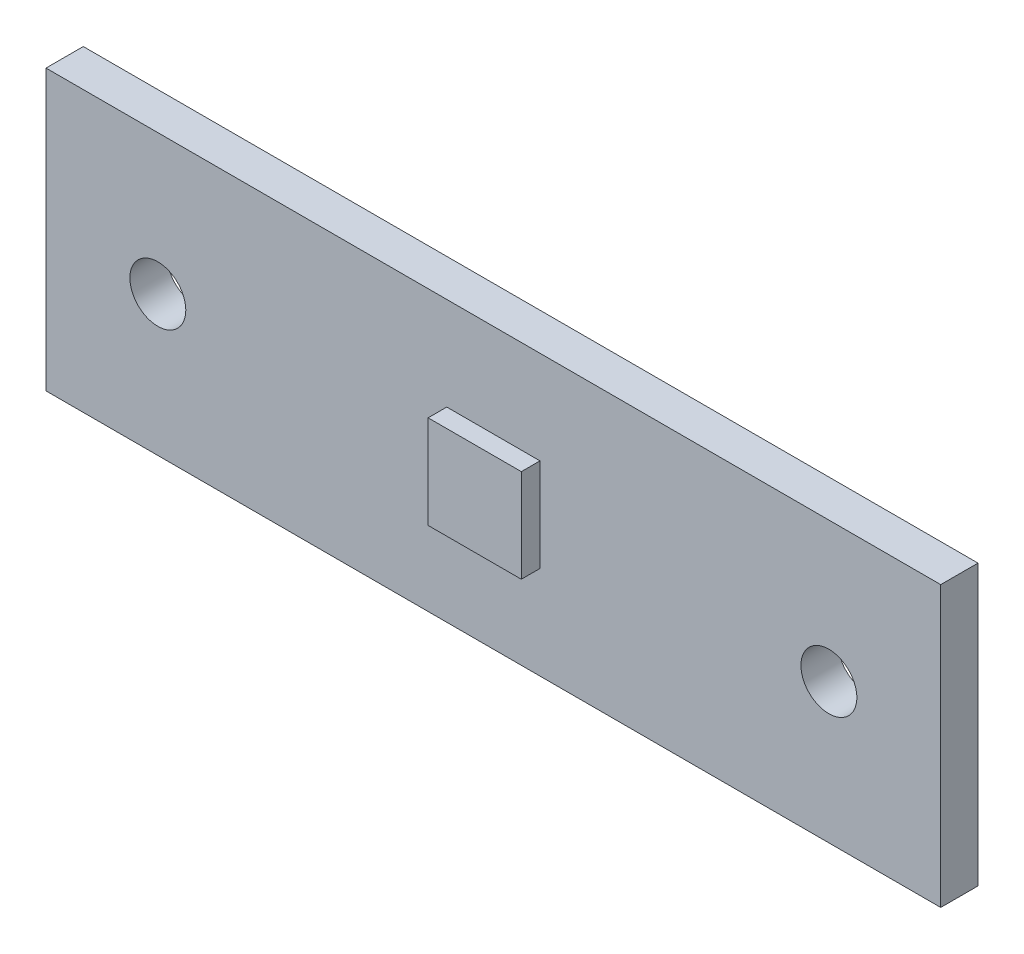
ISO-10303-21;
HEADER;
FILE_DESCRIPTION(('STEP AP214'),'2;1');
FILE_NAME('part.step','',(''),(''),'','','');
FILE_SCHEMA(('AUTOMOTIVE_DESIGN { 1 0 10303 214 1 1 1 1 }'));
ENDSEC;
DATA;
#1=APPLICATION_CONTEXT('core data for automotive mechanical design processes');
#2=APPLICATION_PROTOCOL_DEFINITION('international standard','automotive_design',2000,#1);
#3=PRODUCT_CONTEXT('',#1,'mechanical');
#4=PRODUCT('Part','Part','',(#3));
#5=PRODUCT_RELATED_PRODUCT_CATEGORY('part','',(#4));
#6=PRODUCT_DEFINITION_FORMATION('','',#4);
#7=PRODUCT_DEFINITION_CONTEXT('part definition',#1,'design');
#8=PRODUCT_DEFINITION('design','',#6,#7);
#9=PRODUCT_DEFINITION_SHAPE('','',#8);
#10=(LENGTH_UNIT() NAMED_UNIT(*) SI_UNIT(.MILLI.,.METRE.));
#11=(NAMED_UNIT(*) PLANE_ANGLE_UNIT() SI_UNIT($,.RADIAN.));
#12=(NAMED_UNIT(*) SI_UNIT($,.STERADIAN.) SOLID_ANGLE_UNIT());
#13=UNCERTAINTY_MEASURE_WITH_UNIT(LENGTH_MEASURE(1.E-05),#10,'distance_accuracy_value','');
#14=(GEOMETRIC_REPRESENTATION_CONTEXT(3) GLOBAL_UNCERTAINTY_ASSIGNED_CONTEXT((#13)) GLOBAL_UNIT_ASSIGNED_CONTEXT((#10,
#11,#12)) REPRESENTATION_CONTEXT('',''));
#15=CARTESIAN_POINT('',(0.,0.,0.));
#16=DIRECTION('',(0.,0.,1.));
#17=DIRECTION('',(1.,0.,0.));
#18=AXIS2_PLACEMENT_3D('',#15,#16,#17);
#19=CARTESIAN_POINT('',(0.,0.,2.));
#20=DIRECTION('',(0.,0.,-1.));
#21=DIRECTION('',(-1.,0.,0.));
#22=AXIS2_PLACEMENT_3D('',#19,#20,#21);
#23=PLANE('',#22);
#24=CARTESIAN_POINT('',(42.,7.5,2.));
#25=DIRECTION('',(0.,0.,1.));
#26=DIRECTION('',(-1.,0.,0.));
#27=AXIS2_PLACEMENT_3D('',#24,#25,#26);
#28=CIRCLE('',#27,1.5);
#29=CARTESIAN_POINT('',(40.5,7.5,2.));
#30=VERTEX_POINT('',#29);
#31=EDGE_CURVE('E122',#30,#30,#28,.T.);
#32=ORIENTED_EDGE('',*,*,#31,.F.);
#33=EDGE_LOOP('',(#32));
#34=FACE_BOUND('',#33,.T.);
#35=CARTESIAN_POINT('',(6.,7.5,2.));
#36=DIRECTION('',(0.,0.,1.));
#37=DIRECTION('',(1.,0.,0.));
#38=AXIS2_PLACEMENT_3D('',#35,#36,#37);
#39=CIRCLE('',#38,1.5);
#40=CARTESIAN_POINT('',(7.5,7.5,2.));
#41=VERTEX_POINT('',#40);
#42=EDGE_CURVE('E131',#41,#41,#39,.T.);
#43=ORIENTED_EDGE('',*,*,#42,.F.);
#44=EDGE_LOOP('',(#43));
#45=FACE_BOUND('',#44,.T.);
#46=DIRECTION('',(0.,-1.,0.));
#47=VECTOR('',#46,1.);
#48=CARTESIAN_POINT('',(0.,0.,2.));
#49=LINE('',#48,#47);
#50=CARTESIAN_POINT('',(0.,15.,2.));
#51=VERTEX_POINT('',#50);
#52=CARTESIAN_POINT('',(0.,0.,2.));
#53=VERTEX_POINT('',#52);
#54=EDGE_CURVE('E137',#51,#53,#49,.T.);
#55=ORIENTED_EDGE('',*,*,#54,.T.);
#56=DIRECTION('',(1.,0.,0.));
#57=VECTOR('',#56,1.);
#58=CARTESIAN_POINT('',(0.,0.,2.));
#59=LINE('',#58,#57);
#60=CARTESIAN_POINT('',(48.,0.,2.));
#61=VERTEX_POINT('',#60);
#62=EDGE_CURVE('E140',#53,#61,#59,.T.);
#63=ORIENTED_EDGE('',*,*,#62,.T.);
#64=DIRECTION('',(0.,1.,0.));
#65=VECTOR('',#64,1.);
#66=CARTESIAN_POINT('',(48.,0.,2.));
#67=LINE('',#66,#65);
#68=CARTESIAN_POINT('',(48.,15.,2.));
#69=VERTEX_POINT('',#68);
#70=EDGE_CURVE('E143',#61,#69,#67,.T.);
#71=ORIENTED_EDGE('',*,*,#70,.T.);
#72=DIRECTION('',(-1.,0.,0.));
#73=VECTOR('',#72,1.);
#74=CARTESIAN_POINT('',(0.,15.,2.));
#75=LINE('',#74,#73);
#76=EDGE_CURVE('E145',#69,#51,#75,.T.);
#77=ORIENTED_EDGE('',*,*,#76,.T.);
#78=EDGE_LOOP('',(#55,#63,#71,#77));
#79=FACE_BOUND('',#78,.T.);
#80=DIRECTION('',(0.,1.,0.));
#81=VECTOR('',#80,1.);
#82=CARTESIAN_POINT('',(26.5,5.,2.));
#83=LINE('',#82,#81);
#84=CARTESIAN_POINT('',(26.5,5.,2.));
#85=VERTEX_POINT('',#84);
#86=CARTESIAN_POINT('',(26.5,10.,2.));
#87=VERTEX_POINT('',#86);
#88=EDGE_CURVE('E118',#85,#87,#83,.T.);
#89=ORIENTED_EDGE('',*,*,#88,.F.);
#90=DIRECTION('',(1.,0.,0.));
#91=VECTOR('',#90,1.);
#92=CARTESIAN_POINT('',(21.5,5.,2.));
#93=LINE('',#92,#91);
#94=CARTESIAN_POINT('',(21.5,5.,2.));
#95=VERTEX_POINT('',#94);
#96=EDGE_CURVE('E115',#95,#85,#93,.T.);
#97=ORIENTED_EDGE('',*,*,#96,.F.);
#98=DIRECTION('',(0.,-1.,0.));
#99=VECTOR('',#98,1.);
#100=CARTESIAN_POINT('',(21.5,5.,2.));
#101=LINE('',#100,#99);
#102=CARTESIAN_POINT('',(21.5,10.,2.));
#103=VERTEX_POINT('',#102);
#104=EDGE_CURVE('E53',#103,#95,#101,.T.);
#105=ORIENTED_EDGE('',*,*,#104,.F.);
#106=DIRECTION('',(-1.,0.,0.));
#107=VECTOR('',#106,1.);
#108=CARTESIAN_POINT('',(21.5,10.,2.));
#109=LINE('',#108,#107);
#110=EDGE_CURVE('E48',#87,#103,#109,.T.);
#111=ORIENTED_EDGE('',*,*,#110,.F.);
#112=EDGE_LOOP('',(#89,#97,#105,#111));
#113=FACE_BOUND('',#112,.T.);
#114=ADVANCED_FACE('F33',(#34,#45,#79,#113),#23,.F.);
#115=CARTESIAN_POINT('',(0.,0.,0.));
#116=DIRECTION('',(0.,0.,-1.));
#117=DIRECTION('',(-1.,0.,0.));
#118=AXIS2_PLACEMENT_3D('',#115,#116,#117);
#119=PLANE('',#118);
#120=CARTESIAN_POINT('',(6.,7.5,0.));
#121=DIRECTION('',(0.,0.,1.));
#122=DIRECTION('',(1.,0.,0.));
#123=AXIS2_PLACEMENT_3D('',#120,#121,#122);
#124=CIRCLE('',#123,1.5);
#125=CARTESIAN_POINT('',(7.5,7.5,0.));
#126=VERTEX_POINT('',#125);
#127=EDGE_CURVE('E129',#126,#126,#124,.T.);
#128=ORIENTED_EDGE('',*,*,#127,.T.);
#129=EDGE_LOOP('',(#128));
#130=FACE_BOUND('',#129,.T.);
#131=DIRECTION('',(0.,-1.,0.));
#132=VECTOR('',#131,1.);
#133=CARTESIAN_POINT('',(0.,0.,0.));
#134=LINE('',#133,#132);
#135=CARTESIAN_POINT('',(0.,15.,0.));
#136=VERTEX_POINT('',#135);
#137=CARTESIAN_POINT('',(0.,0.,0.));
#138=VERTEX_POINT('',#137);
#139=EDGE_CURVE('E134',#136,#138,#134,.T.);
#140=ORIENTED_EDGE('',*,*,#139,.F.);
#141=DIRECTION('',(-1.,0.,0.));
#142=VECTOR('',#141,1.);
#143=CARTESIAN_POINT('',(0.,15.,0.));
#144=LINE('',#143,#142);
#145=CARTESIAN_POINT('',(48.,15.,0.));
#146=VERTEX_POINT('',#145);
#147=EDGE_CURVE('E141',#146,#136,#144,.T.);
#148=ORIENTED_EDGE('',*,*,#147,.F.);
#149=DIRECTION('',(0.,1.,0.));
#150=VECTOR('',#149,1.);
#151=CARTESIAN_POINT('',(48.,0.,0.));
#152=LINE('',#151,#150);
#153=CARTESIAN_POINT('',(48.,0.,0.));
#154=VERTEX_POINT('',#153);
#155=EDGE_CURVE('E152',#154,#146,#152,.T.);
#156=ORIENTED_EDGE('',*,*,#155,.F.);
#157=DIRECTION('',(1.,0.,0.));
#158=VECTOR('',#157,1.);
#159=CARTESIAN_POINT('',(0.,0.,0.));
#160=LINE('',#159,#158);
#161=EDGE_CURVE('E150',#138,#154,#160,.T.);
#162=ORIENTED_EDGE('',*,*,#161,.F.);
#163=EDGE_LOOP('',(#140,#148,#156,#162));
#164=FACE_BOUND('',#163,.T.);
#165=CARTESIAN_POINT('',(42.,7.5,0.));
#166=DIRECTION('',(0.,0.,1.));
#167=DIRECTION('',(-1.,0.,0.));
#168=AXIS2_PLACEMENT_3D('',#165,#166,#167);
#169=CIRCLE('',#168,1.5);
#170=CARTESIAN_POINT('',(40.5,7.5,0.));
#171=VERTEX_POINT('',#170);
#172=EDGE_CURVE('E119',#171,#171,#169,.T.);
#173=ORIENTED_EDGE('',*,*,#172,.T.);
#174=EDGE_LOOP('',(#173));
#175=FACE_BOUND('',#174,.T.);
#176=ADVANCED_FACE('F170',(#130,#164,#175),#119,.T.);
#177=CARTESIAN_POINT('',(0.,0.,2.));
#178=DIRECTION('',(1.,0.,0.));
#179=DIRECTION('',(0.,0.,-1.));
#180=AXIS2_PLACEMENT_3D('',#177,#178,#179);
#181=PLANE('',#180);
#182=ORIENTED_EDGE('',*,*,#139,.T.);
#183=DIRECTION('',(0.,0.,-1.));
#184=VECTOR('',#183,1.);
#185=CARTESIAN_POINT('',(0.,0.,2.));
#186=LINE('',#185,#184);
#187=EDGE_CURVE('E11',#53,#138,#186,.T.);
#188=ORIENTED_EDGE('',*,*,#187,.F.);
#189=ORIENTED_EDGE('',*,*,#54,.F.);
#190=DIRECTION('',(0.,0.,-1.));
#191=VECTOR('',#190,1.);
#192=CARTESIAN_POINT('',(0.,15.,2.));
#193=LINE('',#192,#191);
#194=EDGE_CURVE('E147',#51,#136,#193,.T.);
#195=ORIENTED_EDGE('',*,*,#194,.T.);
#196=EDGE_LOOP('',(#182,#188,#189,#195));
#197=FACE_BOUND('',#196,.T.);
#198=ADVANCED_FACE('F35',(#197),#181,.F.);
#199=CARTESIAN_POINT('',(0.,0.,2.));
#200=DIRECTION('',(0.,1.,0.));
#201=DIRECTION('',(0.,0.,1.));
#202=AXIS2_PLACEMENT_3D('',#199,#200,#201);
#203=PLANE('',#202);
#204=ORIENTED_EDGE('',*,*,#161,.T.);
#205=DIRECTION('',(0.,0.,-1.));
#206=VECTOR('',#205,1.);
#207=CARTESIAN_POINT('',(48.,0.,2.));
#208=LINE('',#207,#206);
#209=EDGE_CURVE('E41',#61,#154,#208,.T.);
#210=ORIENTED_EDGE('',*,*,#209,.F.);
#211=ORIENTED_EDGE('',*,*,#62,.F.);
#212=ORIENTED_EDGE('',*,*,#187,.T.);
#213=EDGE_LOOP('',(#204,#210,#211,#212));
#214=FACE_BOUND('',#213,.T.);
#215=ADVANCED_FACE('F180',(#214),#203,.F.);
#216=CARTESIAN_POINT('',(48.,0.,2.));
#217=DIRECTION('',(-1.,0.,0.));
#218=DIRECTION('',(0.,0.,1.));
#219=AXIS2_PLACEMENT_3D('',#216,#217,#218);
#220=PLANE('',#219);
#221=ORIENTED_EDGE('',*,*,#155,.T.);
#222=DIRECTION('',(0.,0.,-1.));
#223=VECTOR('',#222,1.);
#224=CARTESIAN_POINT('',(48.,15.,2.));
#225=LINE('',#224,#223);
#226=EDGE_CURVE('E157',#69,#146,#225,.T.);
#227=ORIENTED_EDGE('',*,*,#226,.F.);
#228=ORIENTED_EDGE('',*,*,#70,.F.);
#229=ORIENTED_EDGE('',*,*,#209,.T.);
#230=EDGE_LOOP('',(#221,#227,#228,#229));
#231=FACE_BOUND('',#230,.T.);
#232=ADVANCED_FACE('F164',(#231),#220,.F.);
#233=CARTESIAN_POINT('',(0.,15.,2.));
#234=DIRECTION('',(0.,-1.,0.));
#235=DIRECTION('',(0.,0.,-1.));
#236=AXIS2_PLACEMENT_3D('',#233,#234,#235);
#237=PLANE('',#236);
#238=ORIENTED_EDGE('',*,*,#147,.T.);
#239=ORIENTED_EDGE('',*,*,#194,.F.);
#240=ORIENTED_EDGE('',*,*,#76,.F.);
#241=ORIENTED_EDGE('',*,*,#226,.T.);
#242=EDGE_LOOP('',(#238,#239,#240,#241));
#243=FACE_BOUND('',#242,.T.);
#244=ADVANCED_FACE('F174',(#243),#237,.F.);
#245=CARTESIAN_POINT('',(6.,7.5,2.));
#246=DIRECTION('',(0.,0.,-1.));
#247=DIRECTION('',(-1.,0.,0.));
#248=AXIS2_PLACEMENT_3D('',#245,#246,#247);
#249=CYLINDRICAL_SURFACE('',#248,1.5);
#250=ORIENTED_EDGE('',*,*,#42,.T.);
#251=EDGE_LOOP('',(#250));
#252=FACE_BOUND('',#251,.T.);
#253=ORIENTED_EDGE('',*,*,#127,.F.);
#254=EDGE_LOOP('',(#253));
#255=FACE_BOUND('',#254,.T.);
#256=ADVANCED_FACE('F198',(#252,#255),#249,.F.);
#257=CARTESIAN_POINT('',(42.,7.5,2.));
#258=DIRECTION('',(0.,0.,-1.));
#259=DIRECTION('',(-1.,0.,0.));
#260=AXIS2_PLACEMENT_3D('',#257,#258,#259);
#261=CYLINDRICAL_SURFACE('',#260,1.5);
#262=ORIENTED_EDGE('',*,*,#31,.T.);
#263=EDGE_LOOP('',(#262));
#264=FACE_BOUND('',#263,.T.);
#265=ORIENTED_EDGE('',*,*,#172,.F.);
#266=EDGE_LOOP('',(#265));
#267=FACE_BOUND('',#266,.T.);
#268=ADVANCED_FACE('F205',(#264,#267),#261,.F.);
#269=CARTESIAN_POINT('',(26.5,5.,3.));
#270=DIRECTION('',(-1.,0.,0.));
#271=DIRECTION('',(0.,0.,1.));
#272=AXIS2_PLACEMENT_3D('',#269,#270,#271);
#273=PLANE('',#272);
#274=ORIENTED_EDGE('',*,*,#88,.T.);
#275=DIRECTION('',(0.,0.,-1.));
#276=VECTOR('',#275,1.);
#277=CARTESIAN_POINT('',(26.5,10.,3.));
#278=LINE('',#277,#276);
#279=CARTESIAN_POINT('',(26.5,10.,3.));
#280=VERTEX_POINT('',#279);
#281=EDGE_CURVE('E99',#280,#87,#278,.T.);
#282=ORIENTED_EDGE('',*,*,#281,.F.);
#283=DIRECTION('',(0.,1.,0.));
#284=VECTOR('',#283,1.);
#285=CARTESIAN_POINT('',(26.5,5.,3.));
#286=LINE('',#285,#284);
#287=CARTESIAN_POINT('',(26.5,5.,3.));
#288=VERTEX_POINT('',#287);
#289=EDGE_CURVE('E106',#288,#280,#286,.T.);
#290=ORIENTED_EDGE('',*,*,#289,.F.);
#291=DIRECTION('',(0.,0.,-1.));
#292=VECTOR('',#291,1.);
#293=CARTESIAN_POINT('',(26.5,5.,3.));
#294=LINE('',#293,#292);
#295=EDGE_CURVE('E301',#288,#85,#294,.T.);
#296=ORIENTED_EDGE('',*,*,#295,.T.);
#297=EDGE_LOOP('',(#274,#282,#290,#296));
#298=FACE_BOUND('',#297,.T.);
#299=ADVANCED_FACE('F117',(#298),#273,.F.);
#300=CARTESIAN_POINT('',(21.5,10.,3.));
#301=DIRECTION('',(0.,-1.,0.));
#302=DIRECTION('',(0.,0.,-1.));
#303=AXIS2_PLACEMENT_3D('',#300,#301,#302);
#304=PLANE('',#303);
#305=ORIENTED_EDGE('',*,*,#110,.T.);
#306=DIRECTION('',(0.,0.,-1.));
#307=VECTOR('',#306,1.);
#308=CARTESIAN_POINT('',(21.5,10.,3.));
#309=LINE('',#308,#307);
#310=CARTESIAN_POINT('',(21.5,10.,3.));
#311=VERTEX_POINT('',#310);
#312=EDGE_CURVE('E102',#311,#103,#309,.T.);
#313=ORIENTED_EDGE('',*,*,#312,.F.);
#314=DIRECTION('',(-1.,0.,0.));
#315=VECTOR('',#314,1.);
#316=CARTESIAN_POINT('',(21.5,10.,3.));
#317=LINE('',#316,#315);
#318=EDGE_CURVE('E95',#280,#311,#317,.T.);
#319=ORIENTED_EDGE('',*,*,#318,.F.);
#320=ORIENTED_EDGE('',*,*,#281,.T.);
#321=EDGE_LOOP('',(#305,#313,#319,#320));
#322=FACE_BOUND('',#321,.T.);
#323=ADVANCED_FACE('F97',(#322),#304,.F.);
#324=CARTESIAN_POINT('',(21.5,5.,3.));
#325=DIRECTION('',(1.,0.,0.));
#326=DIRECTION('',(0.,0.,-1.));
#327=AXIS2_PLACEMENT_3D('',#324,#325,#326);
#328=PLANE('',#327);
#329=ORIENTED_EDGE('',*,*,#104,.T.);
#330=DIRECTION('',(0.,0.,-1.));
#331=VECTOR('',#330,1.);
#332=CARTESIAN_POINT('',(21.5,5.,3.));
#333=LINE('',#332,#331);
#334=CARTESIAN_POINT('',(21.5,5.,3.));
#335=VERTEX_POINT('',#334);
#336=EDGE_CURVE('E124',#335,#95,#333,.T.);
#337=ORIENTED_EDGE('',*,*,#336,.F.);
#338=DIRECTION('',(0.,-1.,0.));
#339=VECTOR('',#338,1.);
#340=CARTESIAN_POINT('',(21.5,5.,3.));
#341=LINE('',#340,#339);
#342=EDGE_CURVE('E105',#311,#335,#341,.T.);
#343=ORIENTED_EDGE('',*,*,#342,.F.);
#344=ORIENTED_EDGE('',*,*,#312,.T.);
#345=EDGE_LOOP('',(#329,#337,#343,#344));
#346=FACE_BOUND('',#345,.T.);
#347=ADVANCED_FACE('F222',(#346),#328,.F.);
#348=CARTESIAN_POINT('',(21.5,5.,3.));
#349=DIRECTION('',(0.,1.,0.));
#350=DIRECTION('',(0.,0.,1.));
#351=AXIS2_PLACEMENT_3D('',#348,#349,#350);
#352=PLANE('',#351);
#353=ORIENTED_EDGE('',*,*,#96,.T.);
#354=ORIENTED_EDGE('',*,*,#295,.F.);
#355=DIRECTION('',(1.,0.,0.));
#356=VECTOR('',#355,1.);
#357=CARTESIAN_POINT('',(21.5,5.,3.));
#358=LINE('',#357,#356);
#359=EDGE_CURVE('E111',#335,#288,#358,.T.);
#360=ORIENTED_EDGE('',*,*,#359,.F.);
#361=ORIENTED_EDGE('',*,*,#336,.T.);
#362=EDGE_LOOP('',(#353,#354,#360,#361));
#363=FACE_BOUND('',#362,.T.);
#364=ADVANCED_FACE('F225',(#363),#352,.F.);
#365=CARTESIAN_POINT('',(0.,0.,3.));
#366=DIRECTION('',(0.,0.,-1.));
#367=DIRECTION('',(-1.,0.,0.));
#368=AXIS2_PLACEMENT_3D('',#365,#366,#367);
#369=PLANE('',#368);
#370=ORIENTED_EDGE('',*,*,#289,.T.);
#371=ORIENTED_EDGE('',*,*,#318,.T.);
#372=ORIENTED_EDGE('',*,*,#342,.T.);
#373=ORIENTED_EDGE('',*,*,#359,.T.);
#374=EDGE_LOOP('',(#370,#371,#372,#373));
#375=FACE_BOUND('',#374,.T.);
#376=ADVANCED_FACE('F109',(#375),#369,.F.);
#377=CLOSED_SHELL('',(#114,#176,#198,#215,#232,#244,#256,#268,#299,#323,#347,#364,#376));
#378=MANIFOLD_SOLID_BREP('B2',#377);
#379=ADVANCED_BREP_SHAPE_REPRESENTATION('',(#18,#378),#14);
#380=SHAPE_DEFINITION_REPRESENTATION(#9,#379);
ENDSEC;
END-ISO-10303-21;
